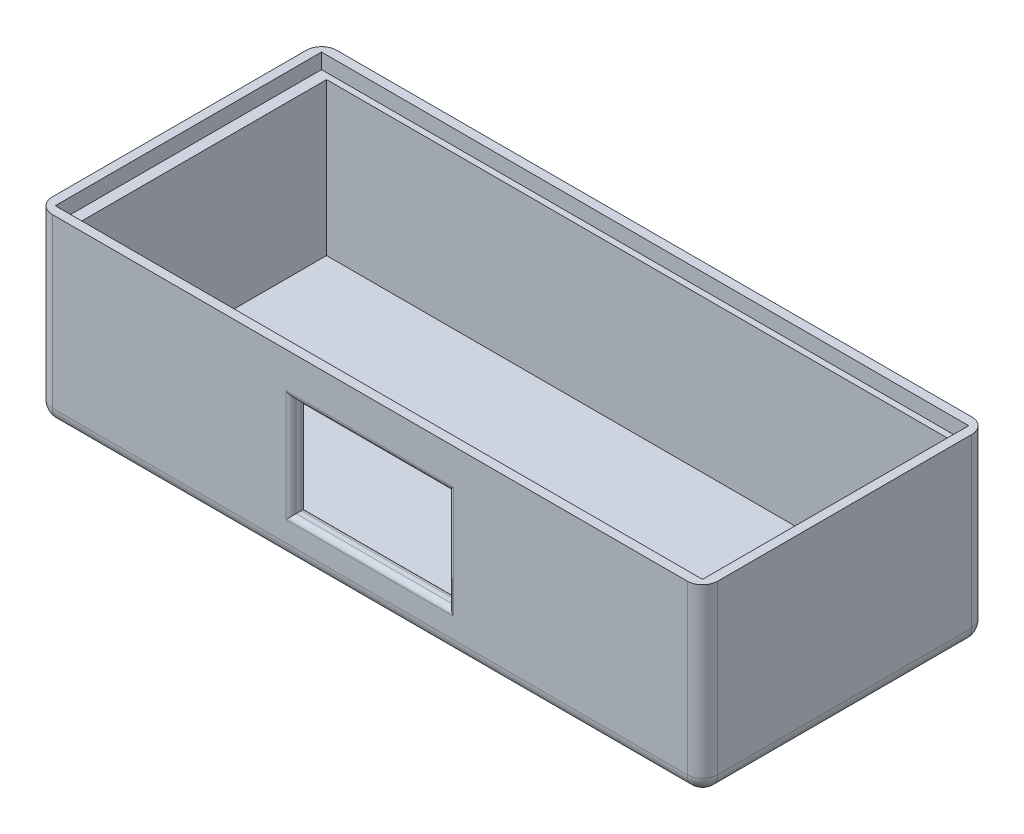
ISO-10303-21;
HEADER;
FILE_DESCRIPTION(('STEP AP214'),'2;1');
FILE_NAME('part.step','',(''),(''),'','','');
FILE_SCHEMA(('AUTOMOTIVE_DESIGN { 1 0 10303 214 1 1 1 1 }'));
ENDSEC;
DATA;
#1=APPLICATION_CONTEXT('core data for automotive mechanical design processes');
#2=APPLICATION_PROTOCOL_DEFINITION('international standard','automotive_design',2000,#1);
#3=PRODUCT_CONTEXT('',#1,'mechanical');
#4=PRODUCT('Part','Part','',(#3));
#5=PRODUCT_RELATED_PRODUCT_CATEGORY('part','',(#4));
#6=PRODUCT_DEFINITION_FORMATION('','',#4);
#7=PRODUCT_DEFINITION_CONTEXT('part definition',#1,'design');
#8=PRODUCT_DEFINITION('design','',#6,#7);
#9=PRODUCT_DEFINITION_SHAPE('','',#8);
#10=(LENGTH_UNIT() NAMED_UNIT(*) SI_UNIT(.MILLI.,.METRE.));
#11=(NAMED_UNIT(*) PLANE_ANGLE_UNIT() SI_UNIT($,.RADIAN.));
#12=(NAMED_UNIT(*) SI_UNIT($,.STERADIAN.) SOLID_ANGLE_UNIT());
#13=UNCERTAINTY_MEASURE_WITH_UNIT(LENGTH_MEASURE(1.E-05),#10,'distance_accuracy_value','');
#14=(GEOMETRIC_REPRESENTATION_CONTEXT(3) GLOBAL_UNCERTAINTY_ASSIGNED_CONTEXT((#13)) GLOBAL_UNIT_ASSIGNED_CONTEXT((#10,
#11,#12)) REPRESENTATION_CONTEXT('',''));
#15=CARTESIAN_POINT('',(0.,0.,0.));
#16=DIRECTION('',(0.,0.,1.));
#17=DIRECTION('',(1.,0.,0.));
#18=AXIS2_PLACEMENT_3D('',#15,#16,#17);
#19=CARTESIAN_POINT('',(-3.,3.,50.));
#20=DIRECTION('',(1.,0.,0.));
#21=DIRECTION('',(0.,1.,0.));
#22=AXIS2_PLACEMENT_3D('',#19,#20,#21);
#23=PLANE('',#22);
#24=DIRECTION('',(0.,0.,-1.));
#25=VECTOR('',#24,1.);
#26=CARTESIAN_POINT('',(-3.,3.,50.));
#27=LINE('',#26,#25);
#28=CARTESIAN_POINT('',(-3.,3.,50.));
#29=VERTEX_POINT('',#28);
#30=CARTESIAN_POINT('',(-3.,3.,0.));
#31=VERTEX_POINT('',#30);
#32=EDGE_CURVE('E366',#29,#31,#27,.T.);
#33=ORIENTED_EDGE('',*,*,#32,.T.);
#34=DIRECTION('',(0.,1.,0.));
#35=VECTOR('',#34,1.);
#36=CARTESIAN_POINT('',(-3.,-33.,0.));
#37=LINE('',#36,#35);
#38=CARTESIAN_POINT('',(-3.,-30.,0.));
#39=VERTEX_POINT('',#38);
#40=EDGE_CURVE('E395',#31,#39,#37,.F.);
#41=ORIENTED_EDGE('',*,*,#40,.T.);
#42=DIRECTION('',(0.,0.,-1.));
#43=VECTOR('',#42,1.);
#44=CARTESIAN_POINT('',(-3.,-30.,50.));
#45=LINE('',#44,#43);
#46=CARTESIAN_POINT('',(-3.,-30.,50.));
#47=VERTEX_POINT('',#46);
#48=EDGE_CURVE('E393',#39,#47,#45,.F.);
#49=ORIENTED_EDGE('',*,*,#48,.T.);
#50=DIRECTION('',(0.,-1.,0.));
#51=VECTOR('',#50,1.);
#52=CARTESIAN_POINT('',(-3.,3.,50.));
#53=LINE('',#52,#51);
#54=EDGE_CURVE('E391',#47,#29,#53,.F.);
#55=ORIENTED_EDGE('',*,*,#54,.T.);
#56=EDGE_LOOP('',(#33,#41,#49,#55));
#57=FACE_BOUND('',#56,.T.);
#58=ADVANCED_FACE('F56',(#57),#23,.F.);
#59=CARTESIAN_POINT('',(-3.,-33.,50.));
#60=DIRECTION('',(0.,1.,0.));
#61=DIRECTION('',(0.,0.,1.));
#62=AXIS2_PLACEMENT_3D('',#59,#60,#61);
#63=PLANE('',#62);
#64=DIRECTION('',(0.,0.,-1.));
#65=VECTOR('',#64,1.);
#66=CARTESIAN_POINT('',(0.,-33.,50.));
#67=LINE('',#66,#65);
#68=CARTESIAN_POINT('',(0.,-33.,50.));
#69=VERTEX_POINT('',#68);
#70=CARTESIAN_POINT('',(0.,-33.,0.));
#71=VERTEX_POINT('',#70);
#72=EDGE_CURVE('E401',#69,#71,#67,.T.);
#73=ORIENTED_EDGE('',*,*,#72,.T.);
#74=DIRECTION('',(-1.,0.,0.));
#75=VECTOR('',#74,1.);
#76=CARTESIAN_POINT('',(128.,-33.,0.));
#77=LINE('',#76,#75);
#78=CARTESIAN_POINT('',(125.,-33.,0.));
#79=VERTEX_POINT('',#78);
#80=EDGE_CURVE('E404',#71,#79,#77,.F.);
#81=ORIENTED_EDGE('',*,*,#80,.T.);
#82=DIRECTION('',(0.,0.,-1.));
#83=VECTOR('',#82,1.);
#84=CARTESIAN_POINT('',(125.,-33.,53.));
#85=LINE('',#84,#83);
#86=CARTESIAN_POINT('',(125.,-33.,50.));
#87=VERTEX_POINT('',#86);
#88=EDGE_CURVE('E399',#79,#87,#85,.F.);
#89=ORIENTED_EDGE('',*,*,#88,.T.);
#90=DIRECTION('',(1.,0.,0.));
#91=VECTOR('',#90,1.);
#92=CARTESIAN_POINT('',(-3.,-33.,50.));
#93=LINE('',#92,#91);
#94=EDGE_CURVE('E397',#87,#69,#93,.F.);
#95=ORIENTED_EDGE('',*,*,#94,.T.);
#96=EDGE_LOOP('',(#73,#81,#89,#95));
#97=FACE_BOUND('',#96,.T.);
#98=DIRECTION('',(1.,0.,0.));
#99=VECTOR('',#98,1.);
#100=CARTESIAN_POINT('',(115.,-33.,22.5));
#101=LINE('',#100,#99);
#102=CARTESIAN_POINT('',(10.,-33.,22.5));
#103=VERTEX_POINT('',#102);
#104=CARTESIAN_POINT('',(115.,-33.,22.5));
#105=VERTEX_POINT('',#104);
#106=EDGE_CURVE('E322',#103,#105,#101,.T.);
#107=ORIENTED_EDGE('',*,*,#106,.F.);
#108=DIRECTION('',(0.,0.,-1.));
#109=VECTOR('',#108,1.);
#110=CARTESIAN_POINT('',(10.,-33.,25.));
#111=LINE('',#110,#109);
#112=CARTESIAN_POINT('',(10.,-33.,27.5));
#113=VERTEX_POINT('',#112);
#114=EDGE_CURVE('E329',#113,#103,#111,.T.);
#115=ORIENTED_EDGE('',*,*,#114,.F.);
#116=DIRECTION('',(-1.,0.,0.));
#117=VECTOR('',#116,1.);
#118=CARTESIAN_POINT('',(10.,-33.,27.5));
#119=LINE('',#118,#117);
#120=CARTESIAN_POINT('',(115.,-33.,27.5));
#121=VERTEX_POINT('',#120);
#122=EDGE_CURVE('E344',#121,#113,#119,.T.);
#123=ORIENTED_EDGE('',*,*,#122,.F.);
#124=DIRECTION('',(0.,0.,1.));
#125=VECTOR('',#124,1.);
#126=CARTESIAN_POINT('',(115.,-33.,27.5));
#127=LINE('',#126,#125);
#128=EDGE_CURVE('E341',#105,#121,#127,.T.);
#129=ORIENTED_EDGE('',*,*,#128,.F.);
#130=EDGE_LOOP('',(#107,#115,#123,#129));
#131=FACE_BOUND('',#130,.T.);
#132=ADVANCED_FACE('F540',(#97,#131),#63,.F.);
#133=CARTESIAN_POINT('',(128.,3.,50.));
#134=DIRECTION('',(1.,0.,0.));
#135=DIRECTION('',(0.,0.,-1.));
#136=AXIS2_PLACEMENT_3D('',#133,#134,#135);
#137=PLANE('',#136);
#138=DIRECTION('',(0.,0.,-1.));
#139=VECTOR('',#138,1.);
#140=CARTESIAN_POINT('',(128.,-30.,-3.));
#141=LINE('',#140,#139);
#142=CARTESIAN_POINT('',(128.,-30.,50.));
#143=VERTEX_POINT('',#142);
#144=CARTESIAN_POINT('',(128.,-30.,0.));
#145=VERTEX_POINT('',#144);
#146=EDGE_CURVE('E408',#143,#145,#141,.T.);
#147=ORIENTED_EDGE('',*,*,#146,.T.);
#148=DIRECTION('',(0.,-1.,0.));
#149=VECTOR('',#148,1.);
#150=CARTESIAN_POINT('',(128.,3.,0.));
#151=LINE('',#150,#149);
#152=CARTESIAN_POINT('',(128.,3.,0.));
#153=VERTEX_POINT('',#152);
#154=EDGE_CURVE('E410',#145,#153,#151,.F.);
#155=ORIENTED_EDGE('',*,*,#154,.T.);
#156=DIRECTION('',(0.,0.,-1.));
#157=VECTOR('',#156,1.);
#158=CARTESIAN_POINT('',(128.,3.,50.));
#159=LINE('',#158,#157);
#160=CARTESIAN_POINT('',(128.,3.,50.));
#161=VERTEX_POINT('',#160);
#162=EDGE_CURVE('E373',#161,#153,#159,.T.);
#163=ORIENTED_EDGE('',*,*,#162,.F.);
#164=DIRECTION('',(0.,1.,0.));
#165=VECTOR('',#164,1.);
#166=CARTESIAN_POINT('',(128.,3.,50.));
#167=LINE('',#166,#165);
#168=EDGE_CURVE('E406',#161,#143,#167,.F.);
#169=ORIENTED_EDGE('',*,*,#168,.T.);
#170=EDGE_LOOP('',(#147,#155,#163,#169));
#171=FACE_BOUND('',#170,.T.);
#172=ADVANCED_FACE('F550',(#171),#137,.T.);
#173=CARTESIAN_POINT('',(-3.,3.,50.));
#174=DIRECTION('',(0.,1.,0.));
#175=DIRECTION('',(0.,0.,1.));
#176=AXIS2_PLACEMENT_3D('',#173,#174,#175);
#177=PLANE('',#176);
#178=DIRECTION('',(0.,0.,1.));
#179=VECTOR('',#178,1.);
#180=CARTESIAN_POINT('',(-1.2,3.,-1.2));
#181=LINE('',#180,#179);
#182=CARTESIAN_POINT('',(-1.2,3.,-1.2));
#183=VERTEX_POINT('',#182);
#184=CARTESIAN_POINT('',(-1.2,3.,51.2));
#185=VERTEX_POINT('',#184);
#186=EDGE_CURVE('E260',#183,#185,#181,.T.);
#187=ORIENTED_EDGE('',*,*,#186,.F.);
#188=DIRECTION('',(1.,0.,0.));
#189=VECTOR('',#188,1.);
#190=CARTESIAN_POINT('',(-1.2,3.,-1.2));
#191=LINE('',#190,#189);
#192=CARTESIAN_POINT('',(126.2,3.,-1.2));
#193=VERTEX_POINT('',#192);
#194=EDGE_CURVE('E278',#183,#193,#191,.T.);
#195=ORIENTED_EDGE('',*,*,#194,.T.);
#196=DIRECTION('',(0.,0.,1.));
#197=VECTOR('',#196,1.);
#198=CARTESIAN_POINT('',(126.2,3.,-1.2));
#199=LINE('',#198,#197);
#200=CARTESIAN_POINT('',(126.2,3.,51.2));
#201=VERTEX_POINT('',#200);
#202=EDGE_CURVE('E281',#193,#201,#199,.T.);
#203=ORIENTED_EDGE('',*,*,#202,.T.);
#204=DIRECTION('',(1.,0.,0.));
#205=VECTOR('',#204,1.);
#206=CARTESIAN_POINT('',(-1.2,3.,51.2));
#207=LINE('',#206,#205);
#208=EDGE_CURVE('E290',#185,#201,#207,.T.);
#209=ORIENTED_EDGE('',*,*,#208,.F.);
#210=EDGE_LOOP('',(#187,#195,#203,#209));
#211=FACE_BOUND('',#210,.T.);
#212=DIRECTION('',(1.,0.,0.));
#213=VECTOR('',#212,1.);
#214=CARTESIAN_POINT('',(128.,3.,-3.));
#215=LINE('',#214,#213);
#216=CARTESIAN_POINT('',(0.,3.,-3.));
#217=VERTEX_POINT('',#216);
#218=CARTESIAN_POINT('',(125.,3.,-3.));
#219=VERTEX_POINT('',#218);
#220=EDGE_CURVE('E351',#217,#219,#215,.T.);
#221=ORIENTED_EDGE('',*,*,#220,.F.);
#222=CARTESIAN_POINT('',(0.,3.,0.));
#223=DIRECTION('',(0.,1.,0.));
#224=DIRECTION('',(0.,0.,1.));
#225=AXIS2_PLACEMENT_3D('',#222,#223,#224);
#226=CIRCLE('',#225,3.);
#227=EDGE_CURVE('E389',#217,#31,#226,.T.);
#228=ORIENTED_EDGE('',*,*,#227,.T.);
#229=ORIENTED_EDGE('',*,*,#32,.F.);
#230=CARTESIAN_POINT('',(0.,3.,50.));
#231=DIRECTION('',(0.,1.,0.));
#232=DIRECTION('',(0.,0.,1.));
#233=AXIS2_PLACEMENT_3D('',#230,#231,#232);
#234=CIRCLE('',#233,3.);
#235=CARTESIAN_POINT('',(0.,3.,53.));
#236=VERTEX_POINT('',#235);
#237=EDGE_CURVE('E383',#29,#236,#234,.T.);
#238=ORIENTED_EDGE('',*,*,#237,.T.);
#239=DIRECTION('',(-1.,0.,0.));
#240=VECTOR('',#239,1.);
#241=CARTESIAN_POINT('',(-3.,3.,53.));
#242=LINE('',#241,#240);
#243=CARTESIAN_POINT('',(125.,3.,53.));
#244=VERTEX_POINT('',#243);
#245=EDGE_CURVE('E297',#244,#236,#242,.T.);
#246=ORIENTED_EDGE('',*,*,#245,.F.);
#247=CARTESIAN_POINT('',(125.,3.,50.));
#248=DIRECTION('',(0.,1.,0.));
#249=DIRECTION('',(0.,0.,1.));
#250=AXIS2_PLACEMENT_3D('',#247,#248,#249);
#251=CIRCLE('',#250,3.);
#252=EDGE_CURVE('E385',#244,#161,#251,.T.);
#253=ORIENTED_EDGE('',*,*,#252,.T.);
#254=ORIENTED_EDGE('',*,*,#162,.T.);
#255=CARTESIAN_POINT('',(125.,3.,0.));
#256=DIRECTION('',(0.,1.,0.));
#257=DIRECTION('',(0.,0.,1.));
#258=AXIS2_PLACEMENT_3D('',#255,#256,#257);
#259=CIRCLE('',#258,3.);
#260=EDGE_CURVE('E387',#153,#219,#259,.T.);
#261=ORIENTED_EDGE('',*,*,#260,.T.);
#262=EDGE_LOOP('',(#221,#228,#229,#238,#246,#253,#254,#261));
#263=FACE_BOUND('',#262,.T.);
#264=ADVANCED_FACE('F560',(#211,#263),#177,.T.);
#265=CARTESIAN_POINT('',(0.,-30.,50.));
#266=DIRECTION('',(0.,1.,0.));
#267=DIRECTION('',(0.,0.,1.));
#268=AXIS2_PLACEMENT_3D('',#265,#266,#267);
#269=PLANE('',#268);
#270=DIRECTION('',(0.,0.,1.));
#271=VECTOR('',#270,1.);
#272=CARTESIAN_POINT('',(124.,-30.,0.));
#273=LINE('',#272,#271);
#274=CARTESIAN_POINT('',(124.,-30.,0.));
#275=VERTEX_POINT('',#274);
#276=CARTESIAN_POINT('',(124.,-30.,50.));
#277=VERTEX_POINT('',#276);
#278=EDGE_CURVE('E309',#275,#277,#273,.T.);
#279=ORIENTED_EDGE('',*,*,#278,.F.);
#280=DIRECTION('',(1.,0.,0.));
#281=VECTOR('',#280,1.);
#282=CARTESIAN_POINT('',(0.,-30.,0.));
#283=LINE('',#282,#281);
#284=CARTESIAN_POINT('',(1.,-30.,0.));
#285=VERTEX_POINT('',#284);
#286=EDGE_CURVE('E363',#285,#275,#283,.T.);
#287=ORIENTED_EDGE('',*,*,#286,.F.);
#288=DIRECTION('',(0.,0.,1.));
#289=VECTOR('',#288,1.);
#290=CARTESIAN_POINT('',(1.,-30.,0.));
#291=LINE('',#290,#289);
#292=CARTESIAN_POINT('',(1.,-30.,50.));
#293=VERTEX_POINT('',#292);
#294=EDGE_CURVE('E316',#285,#293,#291,.T.);
#295=ORIENTED_EDGE('',*,*,#294,.T.);
#296=DIRECTION('',(1.,0.,0.));
#297=VECTOR('',#296,1.);
#298=CARTESIAN_POINT('',(0.,-30.,50.));
#299=LINE('',#298,#297);
#300=EDGE_CURVE('E362',#293,#277,#299,.T.);
#301=ORIENTED_EDGE('',*,*,#300,.T.);
#302=EDGE_LOOP('',(#279,#287,#295,#301));
#303=FACE_BOUND('',#302,.T.);
#304=DIRECTION('',(0.,0.,-1.));
#305=VECTOR('',#304,1.);
#306=CARTESIAN_POINT('',(10.,-30.,22.5));
#307=LINE('',#306,#305);
#308=CARTESIAN_POINT('',(10.,-30.,27.5));
#309=VERTEX_POINT('',#308);
#310=CARTESIAN_POINT('',(10.,-30.,22.5));
#311=VERTEX_POINT('',#310);
#312=EDGE_CURVE('E325',#309,#311,#307,.T.);
#313=ORIENTED_EDGE('',*,*,#312,.T.);
#314=DIRECTION('',(1.,0.,0.));
#315=VECTOR('',#314,1.);
#316=CARTESIAN_POINT('',(115.,-30.,22.5));
#317=LINE('',#316,#315);
#318=CARTESIAN_POINT('',(115.,-30.,22.5));
#319=VERTEX_POINT('',#318);
#320=EDGE_CURVE('E328',#311,#319,#317,.T.);
#321=ORIENTED_EDGE('',*,*,#320,.T.);
#322=DIRECTION('',(0.,0.,1.));
#323=VECTOR('',#322,1.);
#324=CARTESIAN_POINT('',(115.,-30.,25.));
#325=LINE('',#324,#323);
#326=CARTESIAN_POINT('',(115.,-30.,27.5));
#327=VERTEX_POINT('',#326);
#328=EDGE_CURVE('E332',#319,#327,#325,.T.);
#329=ORIENTED_EDGE('',*,*,#328,.T.);
#330=DIRECTION('',(-1.,0.,0.));
#331=VECTOR('',#330,1.);
#332=CARTESIAN_POINT('',(10.,-30.,27.5));
#333=LINE('',#332,#331);
#334=EDGE_CURVE('E335',#327,#309,#333,.T.);
#335=ORIENTED_EDGE('',*,*,#334,.T.);
#336=EDGE_LOOP('',(#313,#321,#329,#335));
#337=FACE_BOUND('',#336,.T.);
#338=ADVANCED_FACE('F876',(#303,#337),#269,.T.);
#339=CARTESIAN_POINT('',(0.,0.,0.));
#340=DIRECTION('',(0.,0.,-1.));
#341=DIRECTION('',(-1.,0.,0.));
#342=AXIS2_PLACEMENT_3D('',#339,#340,#341);
#343=PLANE('',#342);
#344=ORIENTED_EDGE('',*,*,#286,.T.);
#345=DIRECTION('',(0.,-1.,0.));
#346=VECTOR('',#345,1.);
#347=CARTESIAN_POINT('',(124.,0.,0.));
#348=LINE('',#347,#346);
#349=CARTESIAN_POINT('',(124.,0.,0.));
#350=VERTEX_POINT('',#349);
#351=EDGE_CURVE('E304',#350,#275,#348,.T.);
#352=ORIENTED_EDGE('',*,*,#351,.F.);
#353=DIRECTION('',(-1.,0.,0.));
#354=VECTOR('',#353,1.);
#355=CARTESIAN_POINT('',(125.,0.,0.));
#356=LINE('',#355,#354);
#357=CARTESIAN_POINT('',(1.,0.,0.));
#358=VERTEX_POINT('',#357);
#359=EDGE_CURVE('E359',#350,#358,#356,.T.);
#360=ORIENTED_EDGE('',*,*,#359,.T.);
#361=DIRECTION('',(0.,1.,0.));
#362=VECTOR('',#361,1.);
#363=CARTESIAN_POINT('',(1.,0.,0.));
#364=LINE('',#363,#362);
#365=EDGE_CURVE('E313',#285,#358,#364,.T.);
#366=ORIENTED_EDGE('',*,*,#365,.F.);
#367=EDGE_LOOP('',(#344,#352,#360,#366));
#368=FACE_BOUND('',#367,.T.);
#369=ADVANCED_FACE('F869',(#368),#343,.F.);
#370=CARTESIAN_POINT('',(0.,0.,-3.));
#371=DIRECTION('',(0.,0.,-1.));
#372=DIRECTION('',(-1.,0.,0.));
#373=AXIS2_PLACEMENT_3D('',#370,#371,#372);
#374=PLANE('',#373);
#375=DIRECTION('',(-1.,0.,0.));
#376=VECTOR('',#375,1.);
#377=CARTESIAN_POINT('',(-3.,-30.,-3.));
#378=LINE('',#377,#376);
#379=CARTESIAN_POINT('',(125.,-30.,-3.));
#380=VERTEX_POINT('',#379);
#381=CARTESIAN_POINT('',(0.,-30.,-3.));
#382=VERTEX_POINT('',#381);
#383=EDGE_CURVE('E378',#380,#382,#378,.T.);
#384=ORIENTED_EDGE('',*,*,#383,.T.);
#385=DIRECTION('',(0.,1.,0.));
#386=VECTOR('',#385,1.);
#387=CARTESIAN_POINT('',(0.,3.,-3.));
#388=LINE('',#387,#386);
#389=EDGE_CURVE('E380',#382,#217,#388,.T.);
#390=ORIENTED_EDGE('',*,*,#389,.T.);
#391=ORIENTED_EDGE('',*,*,#220,.T.);
#392=DIRECTION('',(0.,-1.,0.));
#393=VECTOR('',#392,1.);
#394=CARTESIAN_POINT('',(125.,0.,-3.));
#395=LINE('',#394,#393);
#396=EDGE_CURVE('E376',#219,#380,#395,.T.);
#397=ORIENTED_EDGE('',*,*,#396,.T.);
#398=EDGE_LOOP('',(#384,#390,#391,#397));
#399=FACE_BOUND('',#398,.T.);
#400=ADVANCED_FACE('F562',(#399),#374,.T.);
#401=CARTESIAN_POINT('',(10.,-30.,25.));
#402=DIRECTION('',(-1.,0.,0.));
#403=DIRECTION('',(0.,0.,1.));
#404=AXIS2_PLACEMENT_3D('',#401,#402,#403);
#405=PLANE('',#404);
#406=ORIENTED_EDGE('',*,*,#114,.T.);
#407=DIRECTION('',(0.,-1.,0.));
#408=VECTOR('',#407,1.);
#409=CARTESIAN_POINT('',(10.,-30.,22.5));
#410=LINE('',#409,#408);
#411=EDGE_CURVE('E338',#311,#103,#410,.T.);
#412=ORIENTED_EDGE('',*,*,#411,.F.);
#413=ORIENTED_EDGE('',*,*,#312,.F.);
#414=DIRECTION('',(0.,-1.,0.));
#415=VECTOR('',#414,1.);
#416=CARTESIAN_POINT('',(10.,-30.,27.5));
#417=LINE('',#416,#415);
#418=EDGE_CURVE('E349',#309,#113,#417,.T.);
#419=ORIENTED_EDGE('',*,*,#418,.T.);
#420=EDGE_LOOP('',(#406,#412,#413,#419));
#421=FACE_BOUND('',#420,.T.);
#422=ADVANCED_FACE('F855',(#421),#405,.F.);
#423=CARTESIAN_POINT('',(10.,-30.,27.5));
#424=DIRECTION('',(0.,0.,1.));
#425=DIRECTION('',(1.,0.,0.));
#426=AXIS2_PLACEMENT_3D('',#423,#424,#425);
#427=PLANE('',#426);
#428=ORIENTED_EDGE('',*,*,#122,.T.);
#429=ORIENTED_EDGE('',*,*,#418,.F.);
#430=ORIENTED_EDGE('',*,*,#334,.F.);
#431=DIRECTION('',(0.,-1.,0.));
#432=VECTOR('',#431,1.);
#433=CARTESIAN_POINT('',(115.,-30.,27.5));
#434=LINE('',#433,#432);
#435=EDGE_CURVE('E352',#327,#121,#434,.T.);
#436=ORIENTED_EDGE('',*,*,#435,.T.);
#437=EDGE_LOOP('',(#428,#429,#430,#436));
#438=FACE_BOUND('',#437,.T.);
#439=ADVANCED_FACE('F847',(#438),#427,.F.);
#440=CARTESIAN_POINT('',(115.,-30.,27.5));
#441=DIRECTION('',(1.,0.,0.));
#442=DIRECTION('',(0.,0.,-1.));
#443=AXIS2_PLACEMENT_3D('',#440,#441,#442);
#444=PLANE('',#443);
#445=ORIENTED_EDGE('',*,*,#128,.T.);
#446=ORIENTED_EDGE('',*,*,#435,.F.);
#447=ORIENTED_EDGE('',*,*,#328,.F.);
#448=DIRECTION('',(0.,-1.,0.));
#449=VECTOR('',#448,1.);
#450=CARTESIAN_POINT('',(115.,-30.,22.5));
#451=LINE('',#450,#449);
#452=EDGE_CURVE('E354',#319,#105,#451,.T.);
#453=ORIENTED_EDGE('',*,*,#452,.T.);
#454=EDGE_LOOP('',(#445,#446,#447,#453));
#455=FACE_BOUND('',#454,.T.);
#456=ADVANCED_FACE('F838',(#455),#444,.F.);
#457=CARTESIAN_POINT('',(115.,-30.,22.5));
#458=DIRECTION('',(0.,0.,-1.));
#459=DIRECTION('',(-1.,0.,0.));
#460=AXIS2_PLACEMENT_3D('',#457,#458,#459);
#461=PLANE('',#460);
#462=ORIENTED_EDGE('',*,*,#106,.T.);
#463=ORIENTED_EDGE('',*,*,#452,.F.);
#464=ORIENTED_EDGE('',*,*,#320,.F.);
#465=ORIENTED_EDGE('',*,*,#411,.T.);
#466=EDGE_LOOP('',(#462,#463,#464,#465));
#467=FACE_BOUND('',#466,.T.);
#468=ADVANCED_FACE('F829',(#467),#461,.F.);
#469=CARTESIAN_POINT('',(1.,0.,0.));
#470=DIRECTION('',(1.,0.,0.));
#471=DIRECTION('',(0.,0.,-1.));
#472=AXIS2_PLACEMENT_3D('',#469,#470,#471);
#473=PLANE('',#472);
#474=DIRECTION('',(0.,1.,0.));
#475=VECTOR('',#474,1.);
#476=CARTESIAN_POINT('',(1.,0.,50.));
#477=LINE('',#476,#475);
#478=CARTESIAN_POINT('',(1.,0.,50.));
#479=VERTEX_POINT('',#478);
#480=EDGE_CURVE('E311',#293,#479,#477,.T.);
#481=ORIENTED_EDGE('',*,*,#480,.F.);
#482=ORIENTED_EDGE('',*,*,#294,.F.);
#483=ORIENTED_EDGE('',*,*,#365,.T.);
#484=DIRECTION('',(0.,0.,1.));
#485=VECTOR('',#484,1.);
#486=CARTESIAN_POINT('',(1.,0.,0.));
#487=LINE('',#486,#485);
#488=EDGE_CURVE('E319',#358,#479,#487,.T.);
#489=ORIENTED_EDGE('',*,*,#488,.T.);
#490=EDGE_LOOP('',(#481,#482,#483,#489));
#491=FACE_BOUND('',#490,.T.);
#492=ADVANCED_FACE('F820',(#491),#473,.T.);
#493=CARTESIAN_POINT('',(124.,0.,0.));
#494=DIRECTION('',(-1.,0.,0.));
#495=DIRECTION('',(0.,0.,1.));
#496=AXIS2_PLACEMENT_3D('',#493,#494,#495);
#497=PLANE('',#496);
#498=DIRECTION('',(0.,-1.,0.));
#499=VECTOR('',#498,1.);
#500=CARTESIAN_POINT('',(124.,0.,50.));
#501=LINE('',#500,#499);
#502=CARTESIAN_POINT('',(124.,0.,50.));
#503=VERTEX_POINT('',#502);
#504=EDGE_CURVE('E303',#503,#277,#501,.T.);
#505=ORIENTED_EDGE('',*,*,#504,.F.);
#506=DIRECTION('',(0.,0.,1.));
#507=VECTOR('',#506,1.);
#508=CARTESIAN_POINT('',(124.,0.,0.));
#509=LINE('',#508,#507);
#510=EDGE_CURVE('E306',#350,#503,#509,.T.);
#511=ORIENTED_EDGE('',*,*,#510,.F.);
#512=ORIENTED_EDGE('',*,*,#351,.T.);
#513=ORIENTED_EDGE('',*,*,#278,.T.);
#514=EDGE_LOOP('',(#505,#511,#512,#513));
#515=FACE_BOUND('',#514,.T.);
#516=ADVANCED_FACE('F809',(#515),#497,.T.);
#517=CARTESIAN_POINT('',(0.,0.,50.));
#518=DIRECTION('',(0.,0.,1.));
#519=DIRECTION('',(1.,0.,0.));
#520=AXIS2_PLACEMENT_3D('',#517,#518,#519);
#521=PLANE('',#520);
#522=DIRECTION('',(0.,1.,0.));
#523=VECTOR('',#522,1.);
#524=CARTESIAN_POINT('',(79.,0.,50.));
#525=LINE('',#524,#523);
#526=CARTESIAN_POINT('',(79.,-26.,50.));
#527=VERTEX_POINT('',#526);
#528=CARTESIAN_POINT('',(79.,-4.,50.));
#529=VERTEX_POINT('',#528);
#530=EDGE_CURVE('E458',#527,#529,#525,.T.);
#531=ORIENTED_EDGE('',*,*,#530,.T.);
#532=DIRECTION('',(-1.,0.,0.));
#533=VECTOR('',#532,1.);
#534=CARTESIAN_POINT('',(0.,-4.,50.));
#535=LINE('',#534,#533);
#536=CARTESIAN_POINT('',(46.,-4.,50.));
#537=VERTEX_POINT('',#536);
#538=EDGE_CURVE('E460',#529,#537,#535,.T.);
#539=ORIENTED_EDGE('',*,*,#538,.T.);
#540=DIRECTION('',(0.,-1.,0.));
#541=VECTOR('',#540,1.);
#542=CARTESIAN_POINT('',(46.,0.,50.));
#543=LINE('',#542,#541);
#544=CARTESIAN_POINT('',(46.,-26.,50.));
#545=VERTEX_POINT('',#544);
#546=EDGE_CURVE('E418',#537,#545,#543,.T.);
#547=ORIENTED_EDGE('',*,*,#546,.T.);
#548=DIRECTION('',(1.,0.,0.));
#549=VECTOR('',#548,1.);
#550=CARTESIAN_POINT('',(0.,-26.,50.));
#551=LINE('',#550,#549);
#552=EDGE_CURVE('E456',#545,#527,#551,.T.);
#553=ORIENTED_EDGE('',*,*,#552,.T.);
#554=EDGE_LOOP('',(#531,#539,#547,#553));
#555=FACE_BOUND('',#554,.T.);
#556=DIRECTION('',(-1.,0.,0.));
#557=VECTOR('',#556,1.);
#558=CARTESIAN_POINT('',(125.,0.,50.));
#559=LINE('',#558,#557);
#560=EDGE_CURVE('E360',#503,#479,#559,.T.);
#561=ORIENTED_EDGE('',*,*,#560,.F.);
#562=ORIENTED_EDGE('',*,*,#504,.T.);
#563=ORIENTED_EDGE('',*,*,#300,.F.);
#564=ORIENTED_EDGE('',*,*,#480,.T.);
#565=EDGE_LOOP('',(#561,#562,#563,#564));
#566=FACE_BOUND('',#565,.T.);
#567=ADVANCED_FACE('F517',(#555,#566),#521,.F.);
#568=CARTESIAN_POINT('',(0.,0.,53.));
#569=DIRECTION('',(0.,0.,1.));
#570=DIRECTION('',(1.,0.,0.));
#571=AXIS2_PLACEMENT_3D('',#568,#569,#570);
#572=PLANE('',#571);
#573=DIRECTION('',(0.,1.,0.));
#574=VECTOR('',#573,1.);
#575=CARTESIAN_POINT('',(79.,-25.,53.));
#576=LINE('',#575,#574);
#577=CARTESIAN_POINT('',(79.,-4.,53.));
#578=VERTEX_POINT('',#577);
#579=CARTESIAN_POINT('',(79.,-26.,53.));
#580=VERTEX_POINT('',#579);
#581=EDGE_CURVE('E73',#578,#580,#576,.F.);
#582=ORIENTED_EDGE('',*,*,#581,.T.);
#583=DIRECTION('',(1.,0.,0.));
#584=VECTOR('',#583,1.);
#585=CARTESIAN_POINT('',(47.,-26.,53.));
#586=LINE('',#585,#584);
#587=CARTESIAN_POINT('',(46.,-26.,53.));
#588=VERTEX_POINT('',#587);
#589=EDGE_CURVE('E481',#580,#588,#586,.F.);
#590=ORIENTED_EDGE('',*,*,#589,.T.);
#591=DIRECTION('',(0.,-1.,0.));
#592=VECTOR('',#591,1.);
#593=CARTESIAN_POINT('',(46.,-5.,53.));
#594=LINE('',#593,#592);
#595=CARTESIAN_POINT('',(46.,-4.,53.));
#596=VERTEX_POINT('',#595);
#597=EDGE_CURVE('E477',#588,#596,#594,.F.);
#598=ORIENTED_EDGE('',*,*,#597,.T.);
#599=DIRECTION('',(-1.,0.,0.));
#600=VECTOR('',#599,1.);
#601=CARTESIAN_POINT('',(78.,-4.,53.));
#602=LINE('',#601,#600);
#603=EDGE_CURVE('E78',#596,#578,#602,.F.);
#604=ORIENTED_EDGE('',*,*,#603,.T.);
#605=EDGE_LOOP('',(#582,#590,#598,#604));
#606=FACE_BOUND('',#605,.T.);
#607=DIRECTION('',(1.,0.,0.));
#608=VECTOR('',#607,1.);
#609=CARTESIAN_POINT('',(128.,-30.,53.));
#610=LINE('',#609,#608);
#611=CARTESIAN_POINT('',(0.,-30.,53.));
#612=VERTEX_POINT('',#611);
#613=CARTESIAN_POINT('',(125.,-30.,53.));
#614=VERTEX_POINT('',#613);
#615=EDGE_CURVE('E414',#612,#614,#610,.T.);
#616=ORIENTED_EDGE('',*,*,#615,.T.);
#617=DIRECTION('',(0.,1.,0.));
#618=VECTOR('',#617,1.);
#619=CARTESIAN_POINT('',(125.,0.,53.));
#620=LINE('',#619,#618);
#621=EDGE_CURVE('E416',#614,#244,#620,.T.);
#622=ORIENTED_EDGE('',*,*,#621,.T.);
#623=ORIENTED_EDGE('',*,*,#245,.T.);
#624=DIRECTION('',(0.,-1.,0.));
#625=VECTOR('',#624,1.);
#626=CARTESIAN_POINT('',(0.,-33.,53.));
#627=LINE('',#626,#625);
#628=EDGE_CURVE('E412',#236,#612,#627,.T.);
#629=ORIENTED_EDGE('',*,*,#628,.T.);
#630=EDGE_LOOP('',(#616,#622,#623,#629));
#631=FACE_BOUND('',#630,.T.);
#632=ADVANCED_FACE('F514',(#606,#631),#572,.T.);
#633=CARTESIAN_POINT('',(0.,0.,0.));
#634=DIRECTION('',(0.,1.,0.));
#635=DIRECTION('',(0.,0.,1.));
#636=AXIS2_PLACEMENT_3D('',#633,#634,#635);
#637=PLANE('',#636);
#638=DIRECTION('',(0.,0.,1.));
#639=VECTOR('',#638,1.);
#640=CARTESIAN_POINT('',(-1.2,0.,-1.2));
#641=LINE('',#640,#639);
#642=CARTESIAN_POINT('',(-1.2,0.,-1.2));
#643=VERTEX_POINT('',#642);
#644=CARTESIAN_POINT('',(-1.2,0.,51.2));
#645=VERTEX_POINT('',#644);
#646=EDGE_CURVE('E258',#643,#645,#641,.T.);
#647=ORIENTED_EDGE('',*,*,#646,.T.);
#648=DIRECTION('',(1.,0.,0.));
#649=VECTOR('',#648,1.);
#650=CARTESIAN_POINT('',(-1.2,0.,51.2));
#651=LINE('',#650,#649);
#652=CARTESIAN_POINT('',(126.2,0.,51.2));
#653=VERTEX_POINT('',#652);
#654=EDGE_CURVE('E269',#645,#653,#651,.T.);
#655=ORIENTED_EDGE('',*,*,#654,.T.);
#656=DIRECTION('',(0.,0.,1.));
#657=VECTOR('',#656,1.);
#658=CARTESIAN_POINT('',(126.2,0.,-1.2));
#659=LINE('',#658,#657);
#660=CARTESIAN_POINT('',(126.2,0.,-1.2));
#661=VERTEX_POINT('',#660);
#662=EDGE_CURVE('E273',#661,#653,#659,.T.);
#663=ORIENTED_EDGE('',*,*,#662,.F.);
#664=DIRECTION('',(1.,0.,0.));
#665=VECTOR('',#664,1.);
#666=CARTESIAN_POINT('',(-1.2,0.,-1.2));
#667=LINE('',#666,#665);
#668=EDGE_CURVE('E265',#643,#661,#667,.T.);
#669=ORIENTED_EDGE('',*,*,#668,.F.);
#670=EDGE_LOOP('',(#647,#655,#663,#669));
#671=FACE_BOUND('',#670,.T.);
#672=ORIENTED_EDGE('',*,*,#359,.F.);
#673=ORIENTED_EDGE('',*,*,#510,.T.);
#674=ORIENTED_EDGE('',*,*,#560,.T.);
#675=ORIENTED_EDGE('',*,*,#488,.F.);
#676=EDGE_LOOP('',(#672,#673,#674,#675));
#677=FACE_BOUND('',#676,.T.);
#678=ADVANCED_FACE('F276',(#671,#677),#637,.T.);
#679=CARTESIAN_POINT('',(-1.2,0.,-1.2));
#680=DIRECTION('',(-1.,0.,0.));
#681=DIRECTION('',(0.,0.,1.));
#682=AXIS2_PLACEMENT_3D('',#679,#680,#681);
#683=PLANE('',#682);
#684=ORIENTED_EDGE('',*,*,#186,.T.);
#685=DIRECTION('',(0.,1.,0.));
#686=VECTOR('',#685,1.);
#687=CARTESIAN_POINT('',(-1.2,0.,51.2));
#688=LINE('',#687,#686);
#689=EDGE_CURVE('E254',#645,#185,#688,.T.);
#690=ORIENTED_EDGE('',*,*,#689,.F.);
#691=ORIENTED_EDGE('',*,*,#646,.F.);
#692=DIRECTION('',(0.,1.,0.));
#693=VECTOR('',#692,1.);
#694=CARTESIAN_POINT('',(-1.2,0.,-1.2));
#695=LINE('',#694,#693);
#696=EDGE_CURVE('E295',#643,#183,#695,.T.);
#697=ORIENTED_EDGE('',*,*,#696,.T.);
#698=EDGE_LOOP('',(#684,#690,#691,#697));
#699=FACE_BOUND('',#698,.T.);
#700=ADVANCED_FACE('F256',(#699),#683,.F.);
#701=CARTESIAN_POINT('',(-1.2,0.,-1.2));
#702=DIRECTION('',(0.,0.,1.));
#703=DIRECTION('',(1.,0.,0.));
#704=AXIS2_PLACEMENT_3D('',#701,#702,#703);
#705=PLANE('',#704);
#706=ORIENTED_EDGE('',*,*,#194,.F.);
#707=ORIENTED_EDGE('',*,*,#696,.F.);
#708=ORIENTED_EDGE('',*,*,#668,.T.);
#709=DIRECTION('',(0.,1.,0.));
#710=VECTOR('',#709,1.);
#711=CARTESIAN_POINT('',(126.2,0.,-1.2));
#712=LINE('',#711,#710);
#713=EDGE_CURVE('E298',#661,#193,#712,.T.);
#714=ORIENTED_EDGE('',*,*,#713,.T.);
#715=EDGE_LOOP('',(#706,#707,#708,#714));
#716=FACE_BOUND('',#715,.T.);
#717=ADVANCED_FACE('F920',(#716),#705,.T.);
#718=CARTESIAN_POINT('',(126.2,0.,-1.2));
#719=DIRECTION('',(-1.,0.,0.));
#720=DIRECTION('',(0.,0.,1.));
#721=AXIS2_PLACEMENT_3D('',#718,#719,#720);
#722=PLANE('',#721);
#723=ORIENTED_EDGE('',*,*,#202,.F.);
#724=ORIENTED_EDGE('',*,*,#713,.F.);
#725=ORIENTED_EDGE('',*,*,#662,.T.);
#726=DIRECTION('',(0.,1.,0.));
#727=VECTOR('',#726,1.);
#728=CARTESIAN_POINT('',(126.2,0.,51.2));
#729=LINE('',#728,#727);
#730=EDGE_CURVE('E264',#653,#201,#729,.T.);
#731=ORIENTED_EDGE('',*,*,#730,.T.);
#732=EDGE_LOOP('',(#723,#724,#725,#731));
#733=FACE_BOUND('',#732,.T.);
#734=ADVANCED_FACE('F911',(#733),#722,.T.);
#735=CARTESIAN_POINT('',(-1.2,0.,51.2));
#736=DIRECTION('',(0.,0.,1.));
#737=DIRECTION('',(1.,0.,0.));
#738=AXIS2_PLACEMENT_3D('',#735,#736,#737);
#739=PLANE('',#738);
#740=ORIENTED_EDGE('',*,*,#208,.T.);
#741=ORIENTED_EDGE('',*,*,#730,.F.);
#742=ORIENTED_EDGE('',*,*,#654,.F.);
#743=ORIENTED_EDGE('',*,*,#689,.T.);
#744=EDGE_LOOP('',(#740,#741,#742,#743));
#745=FACE_BOUND('',#744,.T.);
#746=ADVANCED_FACE('F270',(#745),#739,.F.);
#747=CARTESIAN_POINT('',(47.,-15.,50.));
#748=DIRECTION('',(-1.,0.,0.));
#749=DIRECTION('',(0.,0.,1.));
#750=AXIS2_PLACEMENT_3D('',#747,#748,#749);
#751=PLANE('',#750);
#752=DIRECTION('',(0.,0.,1.));
#753=VECTOR('',#752,1.);
#754=CARTESIAN_POINT('',(47.,-25.,50.));
#755=LINE('',#754,#753);
#756=CARTESIAN_POINT('',(47.,-25.,51.));
#757=VERTEX_POINT('',#756);
#758=CARTESIAN_POINT('',(47.,-25.,52.));
#759=VERTEX_POINT('',#758);
#760=EDGE_CURVE('E284',#757,#759,#755,.T.);
#761=ORIENTED_EDGE('',*,*,#760,.F.);
#762=DIRECTION('',(0.,-1.,0.));
#763=VECTOR('',#762,1.);
#764=CARTESIAN_POINT('',(47.,-15.,51.));
#765=LINE('',#764,#763);
#766=CARTESIAN_POINT('',(47.,-5.,51.));
#767=VERTEX_POINT('',#766);
#768=EDGE_CURVE('E12',#757,#767,#765,.F.);
#769=ORIENTED_EDGE('',*,*,#768,.T.);
#770=DIRECTION('',(0.,0.,1.));
#771=VECTOR('',#770,1.);
#772=CARTESIAN_POINT('',(47.,-5.,50.));
#773=LINE('',#772,#771);
#774=CARTESIAN_POINT('',(47.,-5.,52.));
#775=VERTEX_POINT('',#774);
#776=EDGE_CURVE('E291',#767,#775,#773,.T.);
#777=ORIENTED_EDGE('',*,*,#776,.T.);
#778=DIRECTION('',(0.,-1.,0.));
#779=VECTOR('',#778,1.);
#780=CARTESIAN_POINT('',(47.,-25.,52.));
#781=LINE('',#780,#779);
#782=EDGE_CURVE('E65',#775,#759,#781,.T.);
#783=ORIENTED_EDGE('',*,*,#782,.T.);
#784=EDGE_LOOP('',(#761,#769,#777,#783));
#785=FACE_BOUND('',#784,.T.);
#786=ADVANCED_FACE('F781',(#785),#751,.F.);
#787=CARTESIAN_POINT('',(47.,-5.,50.));
#788=DIRECTION('',(0.,1.,0.));
#789=DIRECTION('',(0.,0.,1.));
#790=AXIS2_PLACEMENT_3D('',#787,#788,#789);
#791=PLANE('',#790);
#792=ORIENTED_EDGE('',*,*,#776,.F.);
#793=DIRECTION('',(-1.,0.,0.));
#794=VECTOR('',#793,1.);
#795=CARTESIAN_POINT('',(47.,-5.,51.));
#796=LINE('',#795,#794);
#797=CARTESIAN_POINT('',(78.,-5.,51.));
#798=VERTEX_POINT('',#797);
#799=EDGE_CURVE('E465',#767,#798,#796,.F.);
#800=ORIENTED_EDGE('',*,*,#799,.T.);
#801=DIRECTION('',(0.,0.,1.));
#802=VECTOR('',#801,1.);
#803=CARTESIAN_POINT('',(78.,-5.,50.));
#804=LINE('',#803,#802);
#805=CARTESIAN_POINT('',(78.,-5.,52.));
#806=VERTEX_POINT('',#805);
#807=EDGE_CURVE('E1037',#798,#806,#804,.T.);
#808=ORIENTED_EDGE('',*,*,#807,.T.);
#809=DIRECTION('',(-1.,0.,0.));
#810=VECTOR('',#809,1.);
#811=CARTESIAN_POINT('',(47.,-5.,52.));
#812=LINE('',#811,#810);
#813=EDGE_CURVE('E463',#806,#775,#812,.T.);
#814=ORIENTED_EDGE('',*,*,#813,.T.);
#815=EDGE_LOOP('',(#792,#800,#808,#814));
#816=FACE_BOUND('',#815,.T.);
#817=ADVANCED_FACE('F772',(#816),#791,.F.);
#818=CARTESIAN_POINT('',(78.,-5.,50.));
#819=DIRECTION('',(1.,0.,0.));
#820=DIRECTION('',(0.,0.,-1.));
#821=AXIS2_PLACEMENT_3D('',#818,#819,#820);
#822=PLANE('',#821);
#823=ORIENTED_EDGE('',*,*,#807,.F.);
#824=DIRECTION('',(0.,1.,0.));
#825=VECTOR('',#824,1.);
#826=CARTESIAN_POINT('',(78.,-5.,51.));
#827=LINE('',#826,#825);
#828=CARTESIAN_POINT('',(78.,-25.,51.));
#829=VERTEX_POINT('',#828);
#830=EDGE_CURVE('E470',#798,#829,#827,.F.);
#831=ORIENTED_EDGE('',*,*,#830,.T.);
#832=DIRECTION('',(0.,0.,1.));
#833=VECTOR('',#832,1.);
#834=CARTESIAN_POINT('',(78.,-25.,50.));
#835=LINE('',#834,#833);
#836=CARTESIAN_POINT('',(78.,-25.,52.));
#837=VERTEX_POINT('',#836);
#838=EDGE_CURVE('E1034',#829,#837,#835,.T.);
#839=ORIENTED_EDGE('',*,*,#838,.T.);
#840=DIRECTION('',(0.,1.,0.));
#841=VECTOR('',#840,1.);
#842=CARTESIAN_POINT('',(78.,-5.,52.));
#843=LINE('',#842,#841);
#844=EDGE_CURVE('E468',#837,#806,#843,.T.);
#845=ORIENTED_EDGE('',*,*,#844,.T.);
#846=EDGE_LOOP('',(#823,#831,#839,#845));
#847=FACE_BOUND('',#846,.T.);
#848=ADVANCED_FACE('F763',(#847),#822,.F.);
#849=CARTESIAN_POINT('',(78.,-25.,50.));
#850=DIRECTION('',(0.,-1.,0.));
#851=DIRECTION('',(0.,0.,-1.));
#852=AXIS2_PLACEMENT_3D('',#849,#850,#851);
#853=PLANE('',#852);
#854=ORIENTED_EDGE('',*,*,#838,.F.);
#855=DIRECTION('',(1.,0.,0.));
#856=VECTOR('',#855,1.);
#857=CARTESIAN_POINT('',(78.,-25.,51.));
#858=LINE('',#857,#856);
#859=EDGE_CURVE('E475',#829,#757,#858,.F.);
#860=ORIENTED_EDGE('',*,*,#859,.T.);
#861=ORIENTED_EDGE('',*,*,#760,.T.);
#862=DIRECTION('',(1.,0.,0.));
#863=VECTOR('',#862,1.);
#864=CARTESIAN_POINT('',(78.,-25.,52.));
#865=LINE('',#864,#863);
#866=EDGE_CURVE('E472',#759,#837,#865,.T.);
#867=ORIENTED_EDGE('',*,*,#866,.T.);
#868=EDGE_LOOP('',(#854,#860,#861,#867));
#869=FACE_BOUND('',#868,.T.);
#870=ADVANCED_FACE('F755',(#869),#853,.F.);
#871=CARTESIAN_POINT('',(125.,0.,50.));
#872=DIRECTION('',(0.,1.,0.));
#873=DIRECTION('',(0.,0.,1.));
#874=AXIS2_PLACEMENT_3D('',#871,#872,#873);
#875=CYLINDRICAL_SURFACE('',#874,3.);
#876=CARTESIAN_POINT('',(125.,-30.,50.));
#877=DIRECTION('',(0.,-1.,0.));
#878=DIRECTION('',(0.,0.,-1.));
#879=AXIS2_PLACEMENT_3D('',#876,#877,#878);
#880=CIRCLE('',#879,3.);
#881=EDGE_CURVE('E452',#143,#614,#880,.T.);
#882=ORIENTED_EDGE('',*,*,#881,.F.);
#883=ORIENTED_EDGE('',*,*,#168,.F.);
#884=ORIENTED_EDGE('',*,*,#252,.F.);
#885=ORIENTED_EDGE('',*,*,#621,.F.);
#886=EDGE_LOOP('',(#882,#883,#884,#885));
#887=FACE_BOUND('',#886,.T.);
#888=ADVANCED_FACE('F529',(#887),#875,.T.);
#889=CARTESIAN_POINT('',(125.,-30.,50.));
#890=DIRECTION('',(0.,0.,1.));
#891=DIRECTION('',(1.,0.,0.));
#892=AXIS2_PLACEMENT_3D('',#889,#890,#891);
#893=SPHERICAL_SURFACE('',#892,3.);
#894=CARTESIAN_POINT('',(125.,-30.,50.));
#895=DIRECTION('',(0.,0.,1.));
#896=DIRECTION('',(1.,0.,0.));
#897=AXIS2_PLACEMENT_3D('',#894,#895,#896);
#898=CIRCLE('',#897,3.);
#899=EDGE_CURVE('E446',#143,#87,#898,.F.);
#900=ORIENTED_EDGE('',*,*,#899,.F.);
#901=ORIENTED_EDGE('',*,*,#881,.T.);
#902=CARTESIAN_POINT('',(125.,-30.,50.));
#903=DIRECTION('',(1.,0.,0.));
#904=DIRECTION('',(0.,0.,-1.));
#905=AXIS2_PLACEMENT_3D('',#902,#903,#904);
#906=CIRCLE('',#905,3.);
#907=EDGE_CURVE('E449',#87,#614,#906,.F.);
#908=ORIENTED_EDGE('',*,*,#907,.F.);
#909=EDGE_LOOP('',(#900,#901,#908));
#910=FACE_BOUND('',#909,.T.);
#911=ADVANCED_FACE('F534',(#910),#893,.T.);
#912=CARTESIAN_POINT('',(0.,0.,50.));
#913=DIRECTION('',(0.,1.,0.));
#914=DIRECTION('',(-1.,0.,0.));
#915=AXIS2_PLACEMENT_3D('',#912,#913,#914);
#916=CYLINDRICAL_SURFACE('',#915,3.);
#917=ORIENTED_EDGE('',*,*,#237,.F.);
#918=ORIENTED_EDGE('',*,*,#54,.F.);
#919=CARTESIAN_POINT('',(0.,-30.,50.));
#920=DIRECTION('',(0.,-1.,0.));
#921=DIRECTION('',(0.,0.,-1.));
#922=AXIS2_PLACEMENT_3D('',#919,#920,#921);
#923=CIRCLE('',#922,3.);
#924=EDGE_CURVE('E443',#612,#47,#923,.T.);
#925=ORIENTED_EDGE('',*,*,#924,.F.);
#926=ORIENTED_EDGE('',*,*,#628,.F.);
#927=EDGE_LOOP('',(#917,#918,#925,#926));
#928=FACE_BOUND('',#927,.T.);
#929=ADVANCED_FACE('F576',(#928),#916,.T.);
#930=CARTESIAN_POINT('',(0.,-30.,50.));
#931=DIRECTION('',(-1.,0.,0.));
#932=DIRECTION('',(0.,0.,1.));
#933=AXIS2_PLACEMENT_3D('',#930,#931,#932);
#934=CYLINDRICAL_SURFACE('',#933,3.);
#935=ORIENTED_EDGE('',*,*,#907,.T.);
#936=ORIENTED_EDGE('',*,*,#615,.F.);
#937=CARTESIAN_POINT('',(0.,-30.,50.));
#938=DIRECTION('',(-1.,0.,0.));
#939=DIRECTION('',(0.,0.,1.));
#940=AXIS2_PLACEMENT_3D('',#937,#938,#939);
#941=CIRCLE('',#940,3.);
#942=EDGE_CURVE('E440',#69,#612,#941,.T.);
#943=ORIENTED_EDGE('',*,*,#942,.F.);
#944=ORIENTED_EDGE('',*,*,#94,.F.);
#945=EDGE_LOOP('',(#935,#936,#943,#944));
#946=FACE_BOUND('',#945,.T.);
#947=ADVANCED_FACE('F537',(#946),#934,.T.);
#948=CARTESIAN_POINT('',(125.,-30.,50.));
#949=DIRECTION('',(0.,0.,1.));
#950=DIRECTION('',(1.,0.,0.));
#951=AXIS2_PLACEMENT_3D('',#948,#949,#950);
#952=CYLINDRICAL_SURFACE('',#951,3.);
#953=ORIENTED_EDGE('',*,*,#899,.T.);
#954=ORIENTED_EDGE('',*,*,#88,.F.);
#955=CARTESIAN_POINT('',(125.,-30.,0.));
#956=DIRECTION('',(0.,0.,-1.));
#957=DIRECTION('',(-1.,0.,0.));
#958=AXIS2_PLACEMENT_3D('',#955,#956,#957);
#959=CIRCLE('',#958,3.);
#960=EDGE_CURVE('E437',#145,#79,#959,.T.);
#961=ORIENTED_EDGE('',*,*,#960,.F.);
#962=ORIENTED_EDGE('',*,*,#146,.F.);
#963=EDGE_LOOP('',(#953,#954,#961,#962));
#964=FACE_BOUND('',#963,.T.);
#965=ADVANCED_FACE('F547',(#964),#952,.T.);
#966=CARTESIAN_POINT('',(125.,0.,0.));
#967=DIRECTION('',(0.,-1.,0.));
#968=DIRECTION('',(0.,0.,-1.));
#969=AXIS2_PLACEMENT_3D('',#966,#967,#968);
#970=CYLINDRICAL_SURFACE('',#969,3.);
#971=ORIENTED_EDGE('',*,*,#260,.F.);
#972=ORIENTED_EDGE('',*,*,#154,.F.);
#973=CARTESIAN_POINT('',(125.,-30.,0.));
#974=DIRECTION('',(0.,-1.,0.));
#975=DIRECTION('',(0.,0.,-1.));
#976=AXIS2_PLACEMENT_3D('',#973,#974,#975);
#977=CIRCLE('',#976,3.);
#978=EDGE_CURVE('E434',#380,#145,#977,.T.);
#979=ORIENTED_EDGE('',*,*,#978,.F.);
#980=ORIENTED_EDGE('',*,*,#396,.F.);
#981=EDGE_LOOP('',(#971,#972,#979,#980));
#982=FACE_BOUND('',#981,.T.);
#983=ADVANCED_FACE('F555',(#982),#970,.T.);
#984=CARTESIAN_POINT('',(0.,-30.,50.));
#985=DIRECTION('',(0.,0.,1.));
#986=DIRECTION('',(1.,0.,0.));
#987=AXIS2_PLACEMENT_3D('',#984,#985,#986);
#988=SPHERICAL_SURFACE('',#987,3.);
#989=ORIENTED_EDGE('',*,*,#942,.T.);
#990=ORIENTED_EDGE('',*,*,#924,.T.);
#991=CARTESIAN_POINT('',(0.,-30.,50.));
#992=DIRECTION('',(0.,0.,1.));
#993=DIRECTION('',(1.,0.,0.));
#994=AXIS2_PLACEMENT_3D('',#991,#992,#993);
#995=CIRCLE('',#994,3.);
#996=EDGE_CURVE('E431',#69,#47,#995,.F.);
#997=ORIENTED_EDGE('',*,*,#996,.F.);
#998=EDGE_LOOP('',(#989,#990,#997));
#999=FACE_BOUND('',#998,.T.);
#1000=ADVANCED_FACE('F578',(#999),#988,.T.);
#1001=CARTESIAN_POINT('',(125.,-30.,0.));
#1002=DIRECTION('',(0.,0.,1.));
#1003=DIRECTION('',(1.,0.,0.));
#1004=AXIS2_PLACEMENT_3D('',#1001,#1002,#1003);
#1005=SPHERICAL_SURFACE('',#1004,3.);
#1006=ORIENTED_EDGE('',*,*,#978,.T.);
#1007=ORIENTED_EDGE('',*,*,#960,.T.);
#1008=CARTESIAN_POINT('',(125.,-30.,0.));
#1009=DIRECTION('',(1.,0.,0.));
#1010=DIRECTION('',(0.,0.,-1.));
#1011=AXIS2_PLACEMENT_3D('',#1008,#1009,#1010);
#1012=CIRCLE('',#1011,3.);
#1013=EDGE_CURVE('E428',#380,#79,#1012,.F.);
#1014=ORIENTED_EDGE('',*,*,#1013,.F.);
#1015=EDGE_LOOP('',(#1006,#1007,#1014));
#1016=FACE_BOUND('',#1015,.T.);
#1017=ADVANCED_FACE('F586',(#1016),#1005,.T.);
#1018=CARTESIAN_POINT('',(0.,-30.,50.));
#1019=DIRECTION('',(0.,0.,-1.));
#1020=DIRECTION('',(-1.,0.,0.));
#1021=AXIS2_PLACEMENT_3D('',#1018,#1019,#1020);
#1022=CYLINDRICAL_SURFACE('',#1021,3.);
#1023=ORIENTED_EDGE('',*,*,#996,.T.);
#1024=ORIENTED_EDGE('',*,*,#48,.F.);
#1025=CARTESIAN_POINT('',(0.,-30.,0.));
#1026=DIRECTION('',(0.,0.,-1.));
#1027=DIRECTION('',(-1.,0.,0.));
#1028=AXIS2_PLACEMENT_3D('',#1025,#1026,#1027);
#1029=CIRCLE('',#1028,3.);
#1030=EDGE_CURVE('E425',#71,#39,#1029,.T.);
#1031=ORIENTED_EDGE('',*,*,#1030,.F.);
#1032=ORIENTED_EDGE('',*,*,#72,.F.);
#1033=EDGE_LOOP('',(#1023,#1024,#1031,#1032));
#1034=FACE_BOUND('',#1033,.T.);
#1035=ADVANCED_FACE('F580',(#1034),#1022,.T.);
#1036=CARTESIAN_POINT('',(0.,-30.,0.));
#1037=DIRECTION('',(1.,0.,0.));
#1038=DIRECTION('',(0.,0.,-1.));
#1039=AXIS2_PLACEMENT_3D('',#1036,#1037,#1038);
#1040=CYLINDRICAL_SURFACE('',#1039,3.);
#1041=ORIENTED_EDGE('',*,*,#1013,.T.);
#1042=ORIENTED_EDGE('',*,*,#80,.F.);
#1043=CARTESIAN_POINT('',(0.,-30.,0.));
#1044=DIRECTION('',(-1.,0.,0.));
#1045=DIRECTION('',(0.,-1.,0.));
#1046=AXIS2_PLACEMENT_3D('',#1043,#1044,#1045);
#1047=CIRCLE('',#1046,3.);
#1048=EDGE_CURVE('E422',#382,#71,#1047,.T.);
#1049=ORIENTED_EDGE('',*,*,#1048,.F.);
#1050=ORIENTED_EDGE('',*,*,#383,.F.);
#1051=EDGE_LOOP('',(#1041,#1042,#1049,#1050));
#1052=FACE_BOUND('',#1051,.T.);
#1053=ADVANCED_FACE('F584',(#1052),#1040,.T.);
#1054=CARTESIAN_POINT('',(0.,-30.,0.));
#1055=DIRECTION('',(0.,0.,1.));
#1056=DIRECTION('',(1.,0.,0.));
#1057=AXIS2_PLACEMENT_3D('',#1054,#1055,#1056);
#1058=SPHERICAL_SURFACE('',#1057,3.);
#1059=ORIENTED_EDGE('',*,*,#1048,.T.);
#1060=ORIENTED_EDGE('',*,*,#1030,.T.);
#1061=CARTESIAN_POINT('',(0.,-30.,0.));
#1062=DIRECTION('',(0.,-1.,0.));
#1063=DIRECTION('',(0.,0.,-1.));
#1064=AXIS2_PLACEMENT_3D('',#1061,#1062,#1063);
#1065=CIRCLE('',#1064,3.);
#1066=EDGE_CURVE('E419',#382,#39,#1065,.F.);
#1067=ORIENTED_EDGE('',*,*,#1066,.F.);
#1068=EDGE_LOOP('',(#1059,#1060,#1067));
#1069=FACE_BOUND('',#1068,.T.);
#1070=ADVANCED_FACE('F606',(#1069),#1058,.T.);
#1071=CARTESIAN_POINT('',(0.,0.,0.));
#1072=DIRECTION('',(0.,-1.,0.));
#1073=DIRECTION('',(1.,0.,0.));
#1074=AXIS2_PLACEMENT_3D('',#1071,#1072,#1073);
#1075=CYLINDRICAL_SURFACE('',#1074,3.);
#1076=ORIENTED_EDGE('',*,*,#1066,.T.);
#1077=ORIENTED_EDGE('',*,*,#40,.F.);
#1078=ORIENTED_EDGE('',*,*,#227,.F.);
#1079=ORIENTED_EDGE('',*,*,#389,.F.);
#1080=EDGE_LOOP('',(#1076,#1077,#1078,#1079));
#1081=FACE_BOUND('',#1080,.T.);
#1082=ADVANCED_FACE('F567',(#1081),#1075,.T.);
#1083=CARTESIAN_POINT('',(0.,-26.,51.));
#1084=DIRECTION('',(1.,0.,0.));
#1085=DIRECTION('',(0.,0.,-1.));
#1086=AXIS2_PLACEMENT_3D('',#1083,#1084,#1085);
#1087=CYLINDRICAL_SURFACE('',#1086,1.);
#1088=CARTESIAN_POINT('',(46.,-26.,51.));
#1089=DIRECTION('',(0.707106781186547,-0.707106781186547,0.));
#1090=DIRECTION('',(0.707106781186547,0.707106781186547,0.));
#1091=AXIS2_PLACEMENT_3D('',#1088,#1089,#1090);
#1092=ELLIPSE('',#1091,1.41421356237309,1.);
#1093=EDGE_CURVE('E488',#757,#545,#1092,.F.);
#1094=ORIENTED_EDGE('',*,*,#1093,.F.);
#1095=ORIENTED_EDGE('',*,*,#859,.F.);
#1096=CARTESIAN_POINT('',(79.,-26.,51.));
#1097=DIRECTION('',(0.707106781186547,0.707106781186547,0.));
#1098=DIRECTION('',(-0.707106781186547,0.707106781186547,0.));
#1099=AXIS2_PLACEMENT_3D('',#1096,#1097,#1098);
#1100=ELLIPSE('',#1099,1.41421356237309,1.);
#1101=EDGE_CURVE('E423',#527,#829,#1100,.T.);
#1102=ORIENTED_EDGE('',*,*,#1101,.F.);
#1103=ORIENTED_EDGE('',*,*,#552,.F.);
#1104=EDGE_LOOP('',(#1094,#1095,#1102,#1103));
#1105=FACE_BOUND('',#1104,.T.);
#1106=ADVANCED_FACE('F605',(#1105),#1087,.T.);
#1107=CARTESIAN_POINT('',(79.,0.,51.));
#1108=DIRECTION('',(0.,1.,0.));
#1109=DIRECTION('',(0.,0.,1.));
#1110=AXIS2_PLACEMENT_3D('',#1107,#1108,#1109);
#1111=CYLINDRICAL_SURFACE('',#1110,1.);
#1112=ORIENTED_EDGE('',*,*,#1101,.T.);
#1113=ORIENTED_EDGE('',*,*,#830,.F.);
#1114=CARTESIAN_POINT('',(79.,-4.,51.));
#1115=DIRECTION('',(-0.707106781186547,0.707106781186547,0.));
#1116=DIRECTION('',(-0.707106781186547,-0.707106781186547,0.));
#1117=AXIS2_PLACEMENT_3D('',#1114,#1115,#1116);
#1118=ELLIPSE('',#1117,1.41421356237309,1.);
#1119=EDGE_CURVE('E486',#529,#798,#1118,.T.);
#1120=ORIENTED_EDGE('',*,*,#1119,.F.);
#1121=ORIENTED_EDGE('',*,*,#530,.F.);
#1122=EDGE_LOOP('',(#1112,#1113,#1120,#1121));
#1123=FACE_BOUND('',#1122,.T.);
#1124=ADVANCED_FACE('F629',(#1123),#1111,.T.);
#1125=CARTESIAN_POINT('',(46.,0.,51.));
#1126=DIRECTION('',(0.,-1.,0.));
#1127=DIRECTION('',(0.,0.,-1.));
#1128=AXIS2_PLACEMENT_3D('',#1125,#1126,#1127);
#1129=CYLINDRICAL_SURFACE('',#1128,1.);
#1130=ORIENTED_EDGE('',*,*,#1093,.T.);
#1131=ORIENTED_EDGE('',*,*,#546,.F.);
#1132=CARTESIAN_POINT('',(46.,-4.,51.));
#1133=DIRECTION('',(-0.707106781186547,-0.707106781186547,0.));
#1134=DIRECTION('',(-0.707106781186547,0.707106781186547,0.));
#1135=AXIS2_PLACEMENT_3D('',#1132,#1133,#1134);
#1136=ELLIPSE('',#1135,1.41421356237309,1.);
#1137=EDGE_CURVE('E484',#767,#537,#1136,.F.);
#1138=ORIENTED_EDGE('',*,*,#1137,.F.);
#1139=ORIENTED_EDGE('',*,*,#768,.F.);
#1140=EDGE_LOOP('',(#1130,#1131,#1138,#1139));
#1141=FACE_BOUND('',#1140,.T.);
#1142=ADVANCED_FACE('F638',(#1141),#1129,.T.);
#1143=CARTESIAN_POINT('',(0.,-4.,51.));
#1144=DIRECTION('',(-1.,0.,0.));
#1145=DIRECTION('',(0.,0.,1.));
#1146=AXIS2_PLACEMENT_3D('',#1143,#1144,#1145);
#1147=CYLINDRICAL_SURFACE('',#1146,1.);
#1148=ORIENTED_EDGE('',*,*,#1119,.T.);
#1149=ORIENTED_EDGE('',*,*,#799,.F.);
#1150=ORIENTED_EDGE('',*,*,#1137,.T.);
#1151=ORIENTED_EDGE('',*,*,#538,.F.);
#1152=EDGE_LOOP('',(#1148,#1149,#1150,#1151));
#1153=FACE_BOUND('',#1152,.T.);
#1154=ADVANCED_FACE('F646',(#1153),#1147,.T.);
#1155=CARTESIAN_POINT('',(47.,-4.,52.));
#1156=DIRECTION('',(1.,0.,0.));
#1157=DIRECTION('',(0.,0.,-1.));
#1158=AXIS2_PLACEMENT_3D('',#1155,#1156,#1157);
#1159=CYLINDRICAL_SURFACE('',#1158,1.);
#1160=CARTESIAN_POINT('',(79.,-4.,52.));
#1161=DIRECTION('',(0.707106781186547,-0.707106781186547,0.));
#1162=DIRECTION('',(-0.707106781186547,-0.707106781186547,0.));
#1163=AXIS2_PLACEMENT_3D('',#1160,#1161,#1162);
#1164=ELLIPSE('',#1163,1.41421356237309,1.);
#1165=EDGE_CURVE('E496',#578,#806,#1164,.T.);
#1166=ORIENTED_EDGE('',*,*,#1165,.F.);
#1167=ORIENTED_EDGE('',*,*,#603,.F.);
#1168=CARTESIAN_POINT('',(46.,-4.,52.));
#1169=DIRECTION('',(0.707106781186547,0.707106781186547,0.));
#1170=DIRECTION('',(0.707106781186547,-0.707106781186547,0.));
#1171=AXIS2_PLACEMENT_3D('',#1168,#1169,#1170);
#1172=ELLIPSE('',#1171,1.41421356237309,1.);
#1173=EDGE_CURVE('E60',#775,#596,#1172,.F.);
#1174=ORIENTED_EDGE('',*,*,#1173,.F.);
#1175=ORIENTED_EDGE('',*,*,#813,.F.);
#1176=EDGE_LOOP('',(#1166,#1167,#1174,#1175));
#1177=FACE_BOUND('',#1176,.T.);
#1178=ADVANCED_FACE('F58',(#1177),#1159,.T.);
#1179=CARTESIAN_POINT('',(46.,-15.,52.));
#1180=DIRECTION('',(0.,1.,0.));
#1181=DIRECTION('',(0.,0.,1.));
#1182=AXIS2_PLACEMENT_3D('',#1179,#1180,#1181);
#1183=CYLINDRICAL_SURFACE('',#1182,1.);
#1184=ORIENTED_EDGE('',*,*,#1173,.T.);
#1185=ORIENTED_EDGE('',*,*,#597,.F.);
#1186=CARTESIAN_POINT('',(46.,-26.,52.));
#1187=DIRECTION('',(-0.707106781186547,0.707106781186547,0.));
#1188=DIRECTION('',(-0.707106781186547,-0.707106781186547,0.));
#1189=AXIS2_PLACEMENT_3D('',#1186,#1187,#1188);
#1190=ELLIPSE('',#1189,1.41421356237309,1.);
#1191=EDGE_CURVE('E495',#759,#588,#1190,.F.);
#1192=ORIENTED_EDGE('',*,*,#1191,.F.);
#1193=ORIENTED_EDGE('',*,*,#782,.F.);
#1194=EDGE_LOOP('',(#1184,#1185,#1192,#1193));
#1195=FACE_BOUND('',#1194,.T.);
#1196=ADVANCED_FACE('F505',(#1195),#1183,.T.);
#1197=CARTESIAN_POINT('',(79.,-5.,52.));
#1198=DIRECTION('',(0.,-1.,0.));
#1199=DIRECTION('',(0.,0.,-1.));
#1200=AXIS2_PLACEMENT_3D('',#1197,#1198,#1199);
#1201=CYLINDRICAL_SURFACE('',#1200,1.);
#1202=ORIENTED_EDGE('',*,*,#1165,.T.);
#1203=ORIENTED_EDGE('',*,*,#844,.F.);
#1204=CARTESIAN_POINT('',(79.,-26.,52.));
#1205=DIRECTION('',(-0.707106781186547,-0.707106781186547,0.));
#1206=DIRECTION('',(-0.707106781186547,0.707106781186547,0.));
#1207=AXIS2_PLACEMENT_3D('',#1204,#1205,#1206);
#1208=ELLIPSE('',#1207,1.41421356237309,1.);
#1209=EDGE_CURVE('E493',#580,#837,#1208,.T.);
#1210=ORIENTED_EDGE('',*,*,#1209,.F.);
#1211=ORIENTED_EDGE('',*,*,#581,.F.);
#1212=EDGE_LOOP('',(#1202,#1203,#1210,#1211));
#1213=FACE_BOUND('',#1212,.T.);
#1214=ADVANCED_FACE('F510',(#1213),#1201,.T.);
#1215=CARTESIAN_POINT('',(78.,-26.,52.));
#1216=DIRECTION('',(-1.,0.,0.));
#1217=DIRECTION('',(0.,0.,1.));
#1218=AXIS2_PLACEMENT_3D('',#1215,#1216,#1217);
#1219=CYLINDRICAL_SURFACE('',#1218,1.);
#1220=ORIENTED_EDGE('',*,*,#1191,.T.);
#1221=ORIENTED_EDGE('',*,*,#589,.F.);
#1222=ORIENTED_EDGE('',*,*,#1209,.T.);
#1223=ORIENTED_EDGE('',*,*,#866,.F.);
#1224=EDGE_LOOP('',(#1220,#1221,#1222,#1223));
#1225=FACE_BOUND('',#1224,.T.);
#1226=ADVANCED_FACE('F513',(#1225),#1219,.T.);
#1227=CLOSED_SHELL('',(#58,#132,#172,#264,#338,#369,#400,#422,#439,#456,#468,#492,#516,#567,
#632,#678,#700,#717,#734,#746,#786,#817,#848,#870,#888,#911,#929,#947,#965,#983,#1000,#1017,
#1035,#1053,#1070,#1082,#1106,#1124,#1142,#1154,#1178,#1196,#1214,#1226));
#1228=MANIFOLD_SOLID_BREP('B2',#1227);
#1229=ADVANCED_BREP_SHAPE_REPRESENTATION('',(#18,#1228),#14);
#1230=SHAPE_DEFINITION_REPRESENTATION(#9,#1229);
ENDSEC;
END-ISO-10303-21;
